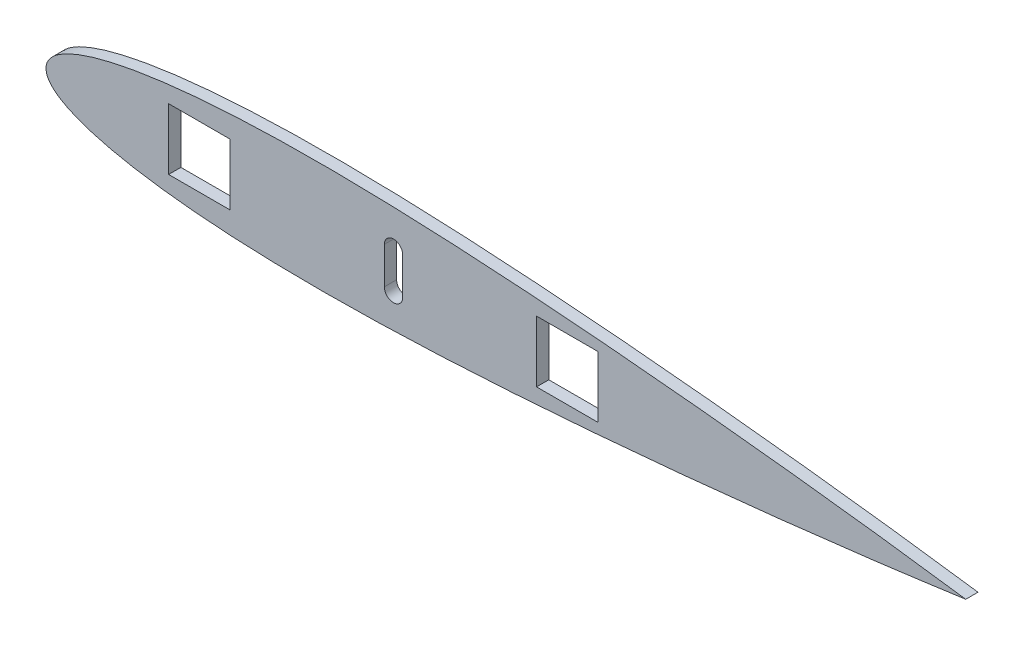
ISO-10303-21;
HEADER;
FILE_DESCRIPTION(('STEP AP214'),'2;1');
FILE_NAME('part.step','',(''),(''),'','','');
FILE_SCHEMA(('AUTOMOTIVE_DESIGN { 1 0 10303 214 1 1 1 1 }'));
ENDSEC;
DATA;
#1=APPLICATION_CONTEXT('core data for automotive mechanical design processes');
#2=APPLICATION_PROTOCOL_DEFINITION('international standard','automotive_design',2000,#1);
#3=PRODUCT_CONTEXT('',#1,'mechanical');
#4=PRODUCT('Part','Part','',(#3));
#5=PRODUCT_RELATED_PRODUCT_CATEGORY('part','',(#4));
#6=PRODUCT_DEFINITION_FORMATION('','',#4);
#7=PRODUCT_DEFINITION_CONTEXT('part definition',#1,'design');
#8=PRODUCT_DEFINITION('design','',#6,#7);
#9=PRODUCT_DEFINITION_SHAPE('','',#8);
#10=(LENGTH_UNIT() NAMED_UNIT(*) SI_UNIT(.MILLI.,.METRE.));
#11=(NAMED_UNIT(*) PLANE_ANGLE_UNIT() SI_UNIT($,.RADIAN.));
#12=(NAMED_UNIT(*) SI_UNIT($,.STERADIAN.) SOLID_ANGLE_UNIT());
#13=UNCERTAINTY_MEASURE_WITH_UNIT(LENGTH_MEASURE(1.E-05),#10,'distance_accuracy_value','');
#14=(GEOMETRIC_REPRESENTATION_CONTEXT(3) GLOBAL_UNCERTAINTY_ASSIGNED_CONTEXT((#13)) GLOBAL_UNIT_ASSIGNED_CONTEXT((#10,
#11,#12)) REPRESENTATION_CONTEXT('',''));
#15=CARTESIAN_POINT('',(0.,0.,0.));
#16=DIRECTION('',(0.,0.,1.));
#17=DIRECTION('',(1.,0.,0.));
#18=AXIS2_PLACEMENT_3D('',#15,#16,#17);
#19=CARTESIAN_POINT('',(73.959377623778,-7.91362684741891,2.));
#20=DIRECTION('',(0.,0.,-1.));
#21=DIRECTION('',(-1.,0.,0.));
#22=AXIS2_PLACEMENT_3D('',#19,#20,#21);
#23=PLANE('',#22);
#24=DIRECTION('',(0.,1.,0.));
#25=VECTOR('',#24,1.);
#26=CARTESIAN_POINT('',(58.1780561277094,-3.27924130211344,2.));
#27=LINE('',#26,#25);
#28=CARTESIAN_POINT('',(58.1780561277094,-3.27924130211344,2.));
#29=VERTEX_POINT('',#28);
#30=CARTESIAN_POINT('',(58.1780561277094,2.72116263132885,2.));
#31=VERTEX_POINT('',#30);
#32=EDGE_CURVE('E175',#29,#31,#27,.T.);
#33=ORIENTED_EDGE('',*,*,#32,.F.);
#34=CARTESIAN_POINT('',(56.6779551443489,-3.27924130211344,2.));
#35=DIRECTION('',(0.,0.,1.));
#36=DIRECTION('',(1.,0.,0.));
#37=AXIS2_PLACEMENT_3D('',#34,#35,#36);
#38=CIRCLE('',#37,1.50010098336057);
#39=CARTESIAN_POINT('',(55.1778541609883,-3.27924130211344,2.));
#40=VERTEX_POINT('',#39);
#41=EDGE_CURVE('E55',#40,#29,#38,.T.);
#42=ORIENTED_EDGE('',*,*,#41,.F.);
#43=DIRECTION('',(0.,-1.,0.));
#44=VECTOR('',#43,1.);
#45=CARTESIAN_POINT('',(55.1778541609883,-3.27924130211344,2.));
#46=LINE('',#45,#44);
#47=CARTESIAN_POINT('',(55.1778541609883,2.72116263132885,2.));
#48=VERTEX_POINT('',#47);
#49=EDGE_CURVE('E162',#48,#40,#46,.T.);
#50=ORIENTED_EDGE('',*,*,#49,.F.);
#51=CARTESIAN_POINT('',(56.6779551443489,2.72116263132885,2.));
#52=DIRECTION('',(0.,0.,1.));
#53=DIRECTION('',(1.,0.,0.));
#54=AXIS2_PLACEMENT_3D('',#51,#52,#53);
#55=CIRCLE('',#54,1.50010098336057);
#56=EDGE_CURVE('E166',#31,#48,#55,.T.);
#57=ORIENTED_EDGE('',*,*,#56,.F.);
#58=EDGE_LOOP('',(#33,#42,#50,#57));
#59=FACE_BOUND('',#58,.T.);
#60=DIRECTION('',(1.,0.,0.));
#61=VECTOR('',#60,1.);
#62=CARTESIAN_POINT('',(20.,5.,2.));
#63=LINE('',#62,#61);
#64=CARTESIAN_POINT('',(20.,5.,2.));
#65=VERTEX_POINT('',#64);
#66=CARTESIAN_POINT('',(30.,5.,2.));
#67=VERTEX_POINT('',#66);
#68=EDGE_CURVE('E211',#65,#67,#63,.T.);
#69=ORIENTED_EDGE('',*,*,#68,.T.);
#70=DIRECTION('',(0.,-1.,0.));
#71=VECTOR('',#70,1.);
#72=CARTESIAN_POINT('',(30.,5.,2.));
#73=LINE('',#72,#71);
#74=CARTESIAN_POINT('',(30.,-5.,2.));
#75=VERTEX_POINT('',#74);
#76=EDGE_CURVE('E259',#67,#75,#73,.T.);
#77=ORIENTED_EDGE('',*,*,#76,.T.);
#78=DIRECTION('',(1.,0.,0.));
#79=VECTOR('',#78,1.);
#80=CARTESIAN_POINT('',(20.,-5.,2.));
#81=LINE('',#80,#79);
#82=CARTESIAN_POINT('',(20.,-5.,2.));
#83=VERTEX_POINT('',#82);
#84=EDGE_CURVE('E254',#83,#75,#81,.T.);
#85=ORIENTED_EDGE('',*,*,#84,.F.);
#86=DIRECTION('',(0.,-1.,0.));
#87=VECTOR('',#86,1.);
#88=CARTESIAN_POINT('',(20.,5.,2.));
#89=LINE('',#88,#87);
#90=EDGE_CURVE('E250',#65,#83,#89,.T.);
#91=ORIENTED_EDGE('',*,*,#90,.F.);
#92=EDGE_LOOP('',(#69,#77,#85,#91));
#93=FACE_BOUND('',#92,.T.);
#94=CARTESIAN_POINT('',(0.,0.,2.));
#95=CARTESIAN_POINT('',(0.0177376787991794,-0.215631790194129,2.));
#96=CARTESIAN_POINT('',(0.0541247272767369,-0.657978530820046,2.));
#97=CARTESIAN_POINT('',(0.343214491645348,-1.29886256852425,2.));
#98=CARTESIAN_POINT('',(0.793518335307111,-1.91545308538195,2.));
#99=CARTESIAN_POINT('',(1.41859373850264,-2.51041162089754,2.));
#100=CARTESIAN_POINT('',(2.21044072610041,-3.085840760044,2.));
#101=CARTESIAN_POINT('',(3.16984033745882,-3.64229027011627,2.));
#102=CARTESIAN_POINT('',(4.29476246222924,-4.17912910418133,2.));
#103=CARTESIAN_POINT('',(5.58341356907541,-4.6951394099258,2.));
#104=CARTESIAN_POINT('',(7.03317259205414,-5.18878374333255,2.));
#105=CARTESIAN_POINT('',(8.64096444597628,-5.65840604873651,2.));
#106=CARTESIAN_POINT('',(11.0808665026297,-6.27289235058471,2.));
#107=CARTESIAN_POINT('',(14.5024468626391,-6.95545406859103,2.));
#108=CARTESIAN_POINT('',(19.0332651731447,-7.62778010369857,2.));
#109=CARTESIAN_POINT('',(24.0847382425464,-8.16948510481198,2.));
#110=CARTESIAN_POINT('',(29.6103003795524,-8.57335056911259,2.));
#111=CARTESIAN_POINT('',(36.6534461757636,-8.88420481359409,2.));
#112=CARTESIAN_POINT('',(45.2685528659167,-8.99448588106023,2.));
#113=CARTESIAN_POINT('',(55.4492469291882,-8.82398055942765,2.));
#114=CARTESIAN_POINT('',(67.2471798380359,-8.34657326807916,2.));
#115=CARTESIAN_POINT('',(80.3841274907154,-7.52487589483776,2.));
#116=CARTESIAN_POINT('',(94.4750896656351,-6.38138479152894,2.));
#117=CARTESIAN_POINT('',(108.784193237314,-5.01561269216372,2.));
#118=CARTESIAN_POINT('',(123.127907022394,-3.46129711721264,2.));
#119=CARTESIAN_POINT('',(136.579140490007,-1.82819578053142,2.));
#120=CARTESIAN_POINT('',(145.420848795191,-0.644801769861778,2.));
#121=CARTESIAN_POINT('',(149.505193272768,-0.0700512290801454,2.));
#122=CARTESIAN_POINT('',(149.970810303824,-0.00413247027789827,2.));
#123=CARTESIAN_POINT('',(150.,0.,2.));
#124=B_SPLINE_CURVE_WITH_KNOTS('',3,(#94,#95,#96,#97,#98,#99,#100,#101,#102,#103,#104,#105,#106,
#107,#108,#109,#110,#111,#112,#113,#114,#115,#116,#117,#118,#119,#120,#121,#122,#123),
.UNSPECIFIED.,.F.,.F.,(4,1,1,1,1,1,1,1,1,1,1,1,1,1,1,1,1,1,1,1,1,1,1,1,1,1,1,4),(0.,
0.00421754175159676,0.00865185901203598,0.013562306112597,0.0191370143035422,0.0254995560399083,
0.0327261684508418,0.0408616428239496,0.049929831579304,0.0599401249287409,0.0708919813887169,
0.082777029169175,0.109285667338437,0.139301077750872,0.172602406915682,0.208924358464581,
0.247964734529063,0.310881145592701,0.377906082539904,0.447678537728095,0.542484026957861,
0.636086647696326,0.724985378551976,0.824439815821109,0.919092538955119,0.990775422468578,
0.999421707975584,1.),.UNSPECIFIED.);
#125=CARTESIAN_POINT('',(0.,0.,2.));
#126=VERTEX_POINT('',#125);
#127=CARTESIAN_POINT('',(150.,0.,2.));
#128=VERTEX_POINT('',#127);
#129=EDGE_CURVE('E277',#126,#128,#124,.T.);
#130=ORIENTED_EDGE('',*,*,#129,.T.);
#131=CARTESIAN_POINT('',(150.,0.,2.));
#132=CARTESIAN_POINT('',(149.970810303824,0.00413247027790093,2.));
#133=CARTESIAN_POINT('',(149.505193272768,0.0700512290801424,2.));
#134=CARTESIAN_POINT('',(145.420848795191,0.644801769861765,2.));
#135=CARTESIAN_POINT('',(136.579140490007,1.82819578053143,2.));
#136=CARTESIAN_POINT('',(123.127907022393,3.46129711721265,2.));
#137=CARTESIAN_POINT('',(108.784193237312,5.01561269216374,2.));
#138=CARTESIAN_POINT('',(94.4750896656351,6.38138479152888,2.));
#139=CARTESIAN_POINT('',(80.384127490716,7.52487589483772,2.));
#140=CARTESIAN_POINT('',(67.2471798380362,8.34657326807912,2.));
#141=CARTESIAN_POINT('',(55.4492469291881,8.82398055942761,2.));
#142=CARTESIAN_POINT('',(45.268552865917,8.99448588106023,2.));
#143=CARTESIAN_POINT('',(36.6534461757634,8.88420481359412,2.));
#144=CARTESIAN_POINT('',(29.6103003795524,8.57335056911259,2.));
#145=CARTESIAN_POINT('',(24.0847382425465,8.16948510481198,2.));
#146=CARTESIAN_POINT('',(19.0332651731446,7.62778010369845,2.));
#147=CARTESIAN_POINT('',(14.502446862639,6.95545406859103,2.));
#148=CARTESIAN_POINT('',(11.0808665026298,6.27289235058471,2.));
#149=CARTESIAN_POINT('',(8.64096444597624,5.65840604873655,2.));
#150=CARTESIAN_POINT('',(7.03317259205418,5.18878374333255,2.));
#151=CARTESIAN_POINT('',(5.58341356907537,4.6951394099258,2.));
#152=CARTESIAN_POINT('',(4.29476246222922,4.17912910418133,2.));
#153=CARTESIAN_POINT('',(3.16984033745883,3.64229027011625,2.));
#154=CARTESIAN_POINT('',(2.21044072610041,3.085840760044,2.));
#155=CARTESIAN_POINT('',(1.41859373850265,2.51041162089755,2.));
#156=CARTESIAN_POINT('',(0.79351833530711,1.91545308538195,2.));
#157=CARTESIAN_POINT('',(0.343214491645345,1.29886256852423,2.));
#158=CARTESIAN_POINT('',(0.0541247272767373,0.657978530820046,2.));
#159=CARTESIAN_POINT('',(0.0177376787991794,0.215631790194129,2.));
#160=CARTESIAN_POINT('',(0.,0.,2.));
#161=B_SPLINE_CURVE_WITH_KNOTS('',3,(#131,#132,#133,#134,#135,#136,#137,#138,#139,#140,#141,
#142,#143,#144,#145,#146,#147,#148,#149,#150,#151,#152,#153,#154,#155,#156,#157,#158,#159,#160),
.UNSPECIFIED.,.F.,.F.,(4,1,1,1,1,1,1,1,1,1,1,1,1,1,1,1,1,1,1,1,1,1,1,1,1,1,1,4),(0.,
0.000578292024416172,0.00922457753142214,0.0809074610448807,0.175560184178891,0.275014621448024,
0.363913352303674,0.457515973042139,0.552321462271905,0.622093917460096,0.689118854407299,
0.752035265470937,0.791075641535419,0.827397593084318,0.860698922249128,0.890714332661563,
0.917222970830825,0.929108018611283,0.940059875071259,0.950070168420696,0.95913835717605,
0.967273831549158,0.974500443960092,0.980862985696458,0.986437693887403,0.991348140987964,
0.995782458248403,1.),.UNSPECIFIED.);
#162=EDGE_CURVE('E284',#128,#126,#161,.T.);
#163=ORIENTED_EDGE('',*,*,#162,.T.);
#164=EDGE_LOOP('',(#130,#163));
#165=FACE_BOUND('',#164,.T.);
#166=DIRECTION('',(1.,0.,0.));
#167=VECTOR('',#166,1.);
#168=CARTESIAN_POINT('',(80.,5.,2.));
#169=LINE('',#168,#167);
#170=CARTESIAN_POINT('',(80.,5.,2.));
#171=VERTEX_POINT('',#170);
#172=CARTESIAN_POINT('',(90.,5.,2.));
#173=VERTEX_POINT('',#172);
#174=EDGE_CURVE('E206',#171,#173,#169,.T.);
#175=ORIENTED_EDGE('',*,*,#174,.T.);
#176=DIRECTION('',(0.,-1.,0.));
#177=VECTOR('',#176,1.);
#178=CARTESIAN_POINT('',(90.,5.,2.));
#179=LINE('',#178,#177);
#180=CARTESIAN_POINT('',(90.,-4.99999999999999,2.));
#181=VERTEX_POINT('',#180);
#182=EDGE_CURVE('E210',#173,#181,#179,.T.);
#183=ORIENTED_EDGE('',*,*,#182,.T.);
#184=DIRECTION('',(1.,0.,0.));
#185=VECTOR('',#184,1.);
#186=CARTESIAN_POINT('',(80.,-4.99999999999999,2.));
#187=LINE('',#186,#185);
#188=CARTESIAN_POINT('',(80.,-4.99999999999999,2.));
#189=VERTEX_POINT('',#188);
#190=EDGE_CURVE('E215',#189,#181,#187,.T.);
#191=ORIENTED_EDGE('',*,*,#190,.F.);
#192=DIRECTION('',(0.,-1.,0.));
#193=VECTOR('',#192,1.);
#194=CARTESIAN_POINT('',(80.,5.,2.));
#195=LINE('',#194,#193);
#196=EDGE_CURVE('E194',#171,#189,#195,.T.);
#197=ORIENTED_EDGE('',*,*,#196,.F.);
#198=EDGE_LOOP('',(#175,#183,#191,#197));
#199=FACE_BOUND('',#198,.T.);
#200=ADVANCED_FACE('F38',(#59,#93,#165,#199),#23,.F.);
#201=CARTESIAN_POINT('',(73.959377623778,-7.91362684741891,0.));
#202=DIRECTION('',(0.,0.,-1.));
#203=DIRECTION('',(-1.,0.,0.));
#204=AXIS2_PLACEMENT_3D('',#201,#202,#203);
#205=PLANE('',#204);
#206=CARTESIAN_POINT('',(56.6779551443489,-3.27924130211344,0.));
#207=DIRECTION('',(0.,0.,1.));
#208=DIRECTION('',(1.,0.,0.));
#209=AXIS2_PLACEMENT_3D('',#206,#207,#208);
#210=CIRCLE('',#209,1.50010098336057);
#211=CARTESIAN_POINT('',(55.1778541609883,-3.27924130211344,0.));
#212=VERTEX_POINT('',#211);
#213=CARTESIAN_POINT('',(58.1780561277094,-3.27924130211344,0.));
#214=VERTEX_POINT('',#213);
#215=EDGE_CURVE('E143',#212,#214,#210,.T.);
#216=ORIENTED_EDGE('',*,*,#215,.T.);
#217=DIRECTION('',(0.,1.,0.));
#218=VECTOR('',#217,1.);
#219=CARTESIAN_POINT('',(58.1780561277094,-3.27924130211344,0.));
#220=LINE('',#219,#218);
#221=CARTESIAN_POINT('',(58.1780561277094,2.72116263132885,0.));
#222=VERTEX_POINT('',#221);
#223=EDGE_CURVE('E153',#214,#222,#220,.T.);
#224=ORIENTED_EDGE('',*,*,#223,.T.);
#225=CARTESIAN_POINT('',(56.6779551443489,2.72116263132885,0.));
#226=DIRECTION('',(0.,0.,1.));
#227=DIRECTION('',(1.,0.,0.));
#228=AXIS2_PLACEMENT_3D('',#225,#226,#227);
#229=CIRCLE('',#228,1.50010098336057);
#230=CARTESIAN_POINT('',(55.1778541609883,2.72116263132885,0.));
#231=VERTEX_POINT('',#230);
#232=EDGE_CURVE('E63',#222,#231,#229,.T.);
#233=ORIENTED_EDGE('',*,*,#232,.T.);
#234=DIRECTION('',(0.,-1.,0.));
#235=VECTOR('',#234,1.);
#236=CARTESIAN_POINT('',(55.1778541609883,-3.27924130211344,0.));
#237=LINE('',#236,#235);
#238=EDGE_CURVE('E150',#231,#212,#237,.T.);
#239=ORIENTED_EDGE('',*,*,#238,.T.);
#240=EDGE_LOOP('',(#216,#224,#233,#239));
#241=FACE_BOUND('',#240,.T.);
#242=CARTESIAN_POINT('',(0.,0.,0.));
#243=CARTESIAN_POINT('',(0.0177376787991794,-0.215631790194129,0.));
#244=CARTESIAN_POINT('',(0.0541247272767369,-0.657978530820046,0.));
#245=CARTESIAN_POINT('',(0.343214491645348,-1.29886256852425,0.));
#246=CARTESIAN_POINT('',(0.793518335307111,-1.91545308538195,0.));
#247=CARTESIAN_POINT('',(1.41859373850264,-2.51041162089754,0.));
#248=CARTESIAN_POINT('',(2.21044072610041,-3.085840760044,0.));
#249=CARTESIAN_POINT('',(3.16984033745882,-3.64229027011627,0.));
#250=CARTESIAN_POINT('',(4.29476246222924,-4.17912910418133,0.));
#251=CARTESIAN_POINT('',(5.58341356907541,-4.6951394099258,0.));
#252=CARTESIAN_POINT('',(7.03317259205414,-5.18878374333255,0.));
#253=CARTESIAN_POINT('',(8.64096444597628,-5.65840604873651,0.));
#254=CARTESIAN_POINT('',(11.0808665026297,-6.27289235058471,0.));
#255=CARTESIAN_POINT('',(14.5024468626391,-6.95545406859103,0.));
#256=CARTESIAN_POINT('',(19.0332651731447,-7.62778010369857,0.));
#257=CARTESIAN_POINT('',(24.0847382425464,-8.16948510481198,0.));
#258=CARTESIAN_POINT('',(29.6103003795524,-8.57335056911259,0.));
#259=CARTESIAN_POINT('',(36.6534461757636,-8.88420481359409,0.));
#260=CARTESIAN_POINT('',(45.2685528659167,-8.99448588106023,0.));
#261=CARTESIAN_POINT('',(55.4492469291882,-8.82398055942765,0.));
#262=CARTESIAN_POINT('',(67.2471798380359,-8.34657326807916,0.));
#263=CARTESIAN_POINT('',(80.3841274907154,-7.52487589483776,0.));
#264=CARTESIAN_POINT('',(94.4750896656351,-6.38138479152894,0.));
#265=CARTESIAN_POINT('',(108.784193237314,-5.01561269216372,0.));
#266=CARTESIAN_POINT('',(123.127907022394,-3.46129711721264,0.));
#267=CARTESIAN_POINT('',(136.579140490007,-1.82819578053142,0.));
#268=CARTESIAN_POINT('',(145.420848795191,-0.644801769861778,0.));
#269=CARTESIAN_POINT('',(149.505193272768,-0.0700512290801454,0.));
#270=CARTESIAN_POINT('',(149.970810303824,-0.00413247027789827,0.));
#271=CARTESIAN_POINT('',(150.,0.,0.));
#272=B_SPLINE_CURVE_WITH_KNOTS('',3,(#242,#243,#244,#245,#246,#247,#248,#249,#250,#251,#252,
#253,#254,#255,#256,#257,#258,#259,#260,#261,#262,#263,#264,#265,#266,#267,#268,#269,#270,#271),
.UNSPECIFIED.,.F.,.F.,(4,1,1,1,1,1,1,1,1,1,1,1,1,1,1,1,1,1,1,1,1,1,1,1,1,1,1,4),(0.,
0.00421754175159676,0.00865185901203598,0.013562306112597,0.0191370143035422,0.0254995560399083,
0.0327261684508418,0.0408616428239496,0.049929831579304,0.0599401249287409,0.0708919813887169,
0.082777029169175,0.109285667338437,0.139301077750872,0.172602406915682,0.208924358464581,
0.247964734529063,0.310881145592701,0.377906082539904,0.447678537728095,0.542484026957861,
0.636086647696326,0.724985378551976,0.824439815821109,0.919092538955119,0.990775422468578,
0.999421707975584,1.),.UNSPECIFIED.);
#273=CARTESIAN_POINT('',(0.,0.,0.));
#274=VERTEX_POINT('',#273);
#275=CARTESIAN_POINT('',(150.,0.,0.));
#276=VERTEX_POINT('',#275);
#277=EDGE_CURVE('E235',#274,#276,#272,.T.);
#278=ORIENTED_EDGE('',*,*,#277,.F.);
#279=CARTESIAN_POINT('',(150.,0.,0.));
#280=CARTESIAN_POINT('',(149.970810303824,0.00413247027790093,0.));
#281=CARTESIAN_POINT('',(149.505193272768,0.0700512290801424,0.));
#282=CARTESIAN_POINT('',(145.420848795191,0.644801769861765,0.));
#283=CARTESIAN_POINT('',(136.579140490007,1.82819578053143,0.));
#284=CARTESIAN_POINT('',(123.127907022393,3.46129711721265,0.));
#285=CARTESIAN_POINT('',(108.784193237312,5.01561269216374,0.));
#286=CARTESIAN_POINT('',(94.4750896656351,6.38138479152888,0.));
#287=CARTESIAN_POINT('',(80.384127490716,7.52487589483772,0.));
#288=CARTESIAN_POINT('',(67.2471798380362,8.34657326807912,0.));
#289=CARTESIAN_POINT('',(55.4492469291881,8.82398055942761,0.));
#290=CARTESIAN_POINT('',(45.268552865917,8.99448588106023,0.));
#291=CARTESIAN_POINT('',(36.6534461757634,8.88420481359412,0.));
#292=CARTESIAN_POINT('',(29.6103003795524,8.57335056911259,0.));
#293=CARTESIAN_POINT('',(24.0847382425465,8.16948510481198,0.));
#294=CARTESIAN_POINT('',(19.0332651731446,7.62778010369845,0.));
#295=CARTESIAN_POINT('',(14.502446862639,6.95545406859103,0.));
#296=CARTESIAN_POINT('',(11.0808665026298,6.27289235058471,0.));
#297=CARTESIAN_POINT('',(8.64096444597624,5.65840604873655,0.));
#298=CARTESIAN_POINT('',(7.03317259205418,5.18878374333255,0.));
#299=CARTESIAN_POINT('',(5.58341356907537,4.6951394099258,0.));
#300=CARTESIAN_POINT('',(4.29476246222922,4.17912910418133,0.));
#301=CARTESIAN_POINT('',(3.16984033745883,3.64229027011625,0.));
#302=CARTESIAN_POINT('',(2.21044072610041,3.085840760044,0.));
#303=CARTESIAN_POINT('',(1.41859373850265,2.51041162089755,0.));
#304=CARTESIAN_POINT('',(0.79351833530711,1.91545308538195,0.));
#305=CARTESIAN_POINT('',(0.343214491645345,1.29886256852423,0.));
#306=CARTESIAN_POINT('',(0.0541247272767373,0.657978530820046,0.));
#307=CARTESIAN_POINT('',(0.0177376787991794,0.215631790194129,0.));
#308=CARTESIAN_POINT('',(0.,0.,0.));
#309=B_SPLINE_CURVE_WITH_KNOTS('',3,(#279,#280,#281,#282,#283,#284,#285,#286,#287,#288,#289,
#290,#291,#292,#293,#294,#295,#296,#297,#298,#299,#300,#301,#302,#303,#304,#305,#306,#307,#308),
.UNSPECIFIED.,.F.,.F.,(4,1,1,1,1,1,1,1,1,1,1,1,1,1,1,1,1,1,1,1,1,1,1,1,1,1,1,4),(0.,
0.000578292024416172,0.00922457753142214,0.0809074610448807,0.175560184178891,0.275014621448024,
0.363913352303674,0.457515973042139,0.552321462271905,0.622093917460096,0.689118854407299,
0.752035265470937,0.791075641535419,0.827397593084318,0.860698922249128,0.890714332661563,
0.917222970830825,0.929108018611283,0.940059875071259,0.950070168420696,0.95913835717605,
0.967273831549158,0.974500443960092,0.980862985696458,0.986437693887403,0.991348140987964,
0.995782458248403,1.),.UNSPECIFIED.);
#310=EDGE_CURVE('E285',#276,#274,#309,.T.);
#311=ORIENTED_EDGE('',*,*,#310,.F.);
#312=EDGE_LOOP('',(#278,#311));
#313=FACE_BOUND('',#312,.T.);
#314=DIRECTION('',(0.,-1.,0.));
#315=VECTOR('',#314,1.);
#316=CARTESIAN_POINT('',(30.,5.,0.));
#317=LINE('',#316,#315);
#318=CARTESIAN_POINT('',(30.,5.,0.));
#319=VERTEX_POINT('',#318);
#320=CARTESIAN_POINT('',(30.,-5.,0.));
#321=VERTEX_POINT('',#320);
#322=EDGE_CURVE('E273',#319,#321,#317,.T.);
#323=ORIENTED_EDGE('',*,*,#322,.F.);
#324=DIRECTION('',(1.,0.,0.));
#325=VECTOR('',#324,1.);
#326=CARTESIAN_POINT('',(20.,5.,0.));
#327=LINE('',#326,#325);
#328=CARTESIAN_POINT('',(20.,5.,0.));
#329=VERTEX_POINT('',#328);
#330=EDGE_CURVE('E255',#329,#319,#327,.T.);
#331=ORIENTED_EDGE('',*,*,#330,.F.);
#332=DIRECTION('',(0.,-1.,0.));
#333=VECTOR('',#332,1.);
#334=CARTESIAN_POINT('',(20.,5.,0.));
#335=LINE('',#334,#333);
#336=CARTESIAN_POINT('',(20.,-5.,0.));
#337=VERTEX_POINT('',#336);
#338=EDGE_CURVE('E249',#329,#337,#335,.T.);
#339=ORIENTED_EDGE('',*,*,#338,.T.);
#340=DIRECTION('',(1.,0.,0.));
#341=VECTOR('',#340,1.);
#342=CARTESIAN_POINT('',(20.,-5.,0.));
#343=LINE('',#342,#341);
#344=EDGE_CURVE('E269',#337,#321,#343,.T.);
#345=ORIENTED_EDGE('',*,*,#344,.T.);
#346=EDGE_LOOP('',(#323,#331,#339,#345));
#347=FACE_BOUND('',#346,.T.);
#348=DIRECTION('',(0.,-1.,0.));
#349=VECTOR('',#348,1.);
#350=CARTESIAN_POINT('',(90.,5.,0.));
#351=LINE('',#350,#349);
#352=CARTESIAN_POINT('',(90.,5.,0.));
#353=VERTEX_POINT('',#352);
#354=CARTESIAN_POINT('',(90.,-4.99999999999999,0.));
#355=VERTEX_POINT('',#354);
#356=EDGE_CURVE('E193',#353,#355,#351,.T.);
#357=ORIENTED_EDGE('',*,*,#356,.F.);
#358=DIRECTION('',(1.,0.,0.));
#359=VECTOR('',#358,1.);
#360=CARTESIAN_POINT('',(80.,5.,0.));
#361=LINE('',#360,#359);
#362=CARTESIAN_POINT('',(80.,5.,0.));
#363=VERTEX_POINT('',#362);
#364=EDGE_CURVE('E190',#363,#353,#361,.T.);
#365=ORIENTED_EDGE('',*,*,#364,.F.);
#366=DIRECTION('',(0.,-1.,0.));
#367=VECTOR('',#366,1.);
#368=CARTESIAN_POINT('',(80.,5.,0.));
#369=LINE('',#368,#367);
#370=CARTESIAN_POINT('',(80.,-4.99999999999999,0.));
#371=VERTEX_POINT('',#370);
#372=EDGE_CURVE('E201',#363,#371,#369,.T.);
#373=ORIENTED_EDGE('',*,*,#372,.T.);
#374=DIRECTION('',(1.,0.,0.));
#375=VECTOR('',#374,1.);
#376=CARTESIAN_POINT('',(80.,-4.99999999999999,0.));
#377=LINE('',#376,#375);
#378=EDGE_CURVE('E197',#371,#355,#377,.T.);
#379=ORIENTED_EDGE('',*,*,#378,.T.);
#380=EDGE_LOOP('',(#357,#365,#373,#379));
#381=FACE_BOUND('',#380,.T.);
#382=ADVANCED_FACE('F158',(#241,#313,#347,#381),#205,.T.);
#383=DIRECTION('',(0.,0.,-1.));
#384=VECTOR('',#383,1.);
#385=SURFACE_OF_LINEAR_EXTRUSION('',#124,#384);
#386=ORIENTED_EDGE('',*,*,#277,.T.);
#387=DIRECTION('',(0.,0.,-1.));
#388=VECTOR('',#387,1.);
#389=CARTESIAN_POINT('',(150.,0.,2.));
#390=LINE('',#389,#388);
#391=EDGE_CURVE('E11',#128,#276,#390,.T.);
#392=ORIENTED_EDGE('',*,*,#391,.F.);
#393=ORIENTED_EDGE('',*,*,#129,.F.);
#394=DIRECTION('',(0.,0.,-1.));
#395=VECTOR('',#394,1.);
#396=CARTESIAN_POINT('',(0.,0.,2.));
#397=LINE('',#396,#395);
#398=EDGE_CURVE('E48',#126,#274,#397,.T.);
#399=ORIENTED_EDGE('',*,*,#398,.T.);
#400=EDGE_LOOP('',(#386,#392,#393,#399));
#401=FACE_BOUND('',#400,.T.);
#402=ADVANCED_FACE('F40',(#401),#385,.F.);
#403=DIRECTION('',(0.,0.,-1.));
#404=VECTOR('',#403,1.);
#405=SURFACE_OF_LINEAR_EXTRUSION('',#161,#404);
#406=ORIENTED_EDGE('',*,*,#310,.T.);
#407=ORIENTED_EDGE('',*,*,#398,.F.);
#408=ORIENTED_EDGE('',*,*,#162,.F.);
#409=ORIENTED_EDGE('',*,*,#391,.T.);
#410=EDGE_LOOP('',(#406,#407,#408,#409));
#411=FACE_BOUND('',#410,.T.);
#412=ADVANCED_FACE('F300',(#411),#405,.F.);
#413=CARTESIAN_POINT('',(20.,5.,0.));
#414=DIRECTION('',(0.,-1.,0.));
#415=DIRECTION('',(0.,0.,-1.));
#416=AXIS2_PLACEMENT_3D('',#413,#414,#415);
#417=PLANE('',#416);
#418=ORIENTED_EDGE('',*,*,#68,.F.);
#419=DIRECTION('',(0.,0.,1.));
#420=VECTOR('',#419,1.);
#421=CARTESIAN_POINT('',(20.,5.,0.));
#422=LINE('',#421,#420);
#423=EDGE_CURVE('E245',#329,#65,#422,.T.);
#424=ORIENTED_EDGE('',*,*,#423,.F.);
#425=ORIENTED_EDGE('',*,*,#330,.T.);
#426=DIRECTION('',(0.,0.,1.));
#427=VECTOR('',#426,1.);
#428=CARTESIAN_POINT('',(30.,5.,0.));
#429=LINE('',#428,#427);
#430=EDGE_CURVE('E184',#319,#67,#429,.T.);
#431=ORIENTED_EDGE('',*,*,#430,.T.);
#432=EDGE_LOOP('',(#418,#424,#425,#431));
#433=FACE_BOUND('',#432,.T.);
#434=ADVANCED_FACE('F303',(#433),#417,.T.);
#435=CARTESIAN_POINT('',(30.,5.,0.));
#436=DIRECTION('',(-1.,0.,0.));
#437=DIRECTION('',(0.,0.,1.));
#438=AXIS2_PLACEMENT_3D('',#435,#436,#437);
#439=PLANE('',#438);
#440=ORIENTED_EDGE('',*,*,#76,.F.);
#441=ORIENTED_EDGE('',*,*,#430,.F.);
#442=ORIENTED_EDGE('',*,*,#322,.T.);
#443=DIRECTION('',(0.,0.,1.));
#444=VECTOR('',#443,1.);
#445=CARTESIAN_POINT('',(30.,-5.,0.));
#446=LINE('',#445,#444);
#447=EDGE_CURVE('E239',#321,#75,#446,.T.);
#448=ORIENTED_EDGE('',*,*,#447,.T.);
#449=EDGE_LOOP('',(#440,#441,#442,#448));
#450=FACE_BOUND('',#449,.T.);
#451=ADVANCED_FACE('F318',(#450),#439,.T.);
#452=CARTESIAN_POINT('',(20.,-5.,0.));
#453=DIRECTION('',(0.,-1.,0.));
#454=DIRECTION('',(1.,0.,0.));
#455=AXIS2_PLACEMENT_3D('',#452,#453,#454);
#456=PLANE('',#455);
#457=ORIENTED_EDGE('',*,*,#84,.T.);
#458=ORIENTED_EDGE('',*,*,#447,.F.);
#459=ORIENTED_EDGE('',*,*,#344,.F.);
#460=DIRECTION('',(0.,0.,1.));
#461=VECTOR('',#460,1.);
#462=CARTESIAN_POINT('',(20.,-5.,0.));
#463=LINE('',#462,#461);
#464=EDGE_CURVE('E242',#337,#83,#463,.T.);
#465=ORIENTED_EDGE('',*,*,#464,.T.);
#466=EDGE_LOOP('',(#457,#458,#459,#465));
#467=FACE_BOUND('',#466,.T.);
#468=ADVANCED_FACE('F314',(#467),#456,.F.);
#469=CARTESIAN_POINT('',(20.,5.,0.));
#470=DIRECTION('',(-1.,0.,0.));
#471=DIRECTION('',(0.,0.,1.));
#472=AXIS2_PLACEMENT_3D('',#469,#470,#471);
#473=PLANE('',#472);
#474=ORIENTED_EDGE('',*,*,#90,.T.);
#475=ORIENTED_EDGE('',*,*,#464,.F.);
#476=ORIENTED_EDGE('',*,*,#338,.F.);
#477=ORIENTED_EDGE('',*,*,#423,.T.);
#478=EDGE_LOOP('',(#474,#475,#476,#477));
#479=FACE_BOUND('',#478,.T.);
#480=ADVANCED_FACE('F310',(#479),#473,.F.);
#481=CARTESIAN_POINT('',(80.,5.,0.));
#482=DIRECTION('',(0.,-1.,0.));
#483=DIRECTION('',(0.,0.,-1.));
#484=AXIS2_PLACEMENT_3D('',#481,#482,#483);
#485=PLANE('',#484);
#486=ORIENTED_EDGE('',*,*,#174,.F.);
#487=DIRECTION('',(0.,0.,1.));
#488=VECTOR('',#487,1.);
#489=CARTESIAN_POINT('',(80.,5.,0.));
#490=LINE('',#489,#488);
#491=EDGE_CURVE('E205',#363,#171,#490,.T.);
#492=ORIENTED_EDGE('',*,*,#491,.F.);
#493=ORIENTED_EDGE('',*,*,#364,.T.);
#494=DIRECTION('',(0.,0.,1.));
#495=VECTOR('',#494,1.);
#496=CARTESIAN_POINT('',(90.,5.,0.));
#497=LINE('',#496,#495);
#498=EDGE_CURVE('E231',#353,#173,#497,.T.);
#499=ORIENTED_EDGE('',*,*,#498,.T.);
#500=EDGE_LOOP('',(#486,#492,#493,#499));
#501=FACE_BOUND('',#500,.T.);
#502=ADVANCED_FACE('F313',(#501),#485,.T.);
#503=CARTESIAN_POINT('',(90.,5.,0.));
#504=DIRECTION('',(-1.,0.,0.));
#505=DIRECTION('',(0.,0.,1.));
#506=AXIS2_PLACEMENT_3D('',#503,#504,#505);
#507=PLANE('',#506);
#508=ORIENTED_EDGE('',*,*,#182,.F.);
#509=ORIENTED_EDGE('',*,*,#498,.F.);
#510=ORIENTED_EDGE('',*,*,#356,.T.);
#511=DIRECTION('',(0.,0.,1.));
#512=VECTOR('',#511,1.);
#513=CARTESIAN_POINT('',(90.,-4.99999999999999,0.));
#514=LINE('',#513,#512);
#515=EDGE_CURVE('E228',#355,#181,#514,.T.);
#516=ORIENTED_EDGE('',*,*,#515,.T.);
#517=EDGE_LOOP('',(#508,#509,#510,#516));
#518=FACE_BOUND('',#517,.T.);
#519=ADVANCED_FACE('F328',(#518),#507,.T.);
#520=CARTESIAN_POINT('',(80.,-4.99999999999999,0.));
#521=DIRECTION('',(0.,-1.,0.));
#522=DIRECTION('',(0.,0.,-1.));
#523=AXIS2_PLACEMENT_3D('',#520,#521,#522);
#524=PLANE('',#523);
#525=ORIENTED_EDGE('',*,*,#190,.T.);
#526=ORIENTED_EDGE('',*,*,#515,.F.);
#527=ORIENTED_EDGE('',*,*,#378,.F.);
#528=DIRECTION('',(0.,0.,1.));
#529=VECTOR('',#528,1.);
#530=CARTESIAN_POINT('',(80.,-4.99999999999999,0.));
#531=LINE('',#530,#529);
#532=EDGE_CURVE('E225',#371,#189,#531,.T.);
#533=ORIENTED_EDGE('',*,*,#532,.T.);
#534=EDGE_LOOP('',(#525,#526,#527,#533));
#535=FACE_BOUND('',#534,.T.);
#536=ADVANCED_FACE('F332',(#535),#524,.F.);
#537=CARTESIAN_POINT('',(80.,5.,0.));
#538=DIRECTION('',(-1.,0.,0.));
#539=DIRECTION('',(0.,0.,1.));
#540=AXIS2_PLACEMENT_3D('',#537,#538,#539);
#541=PLANE('',#540);
#542=ORIENTED_EDGE('',*,*,#196,.T.);
#543=ORIENTED_EDGE('',*,*,#532,.F.);
#544=ORIENTED_EDGE('',*,*,#372,.F.);
#545=ORIENTED_EDGE('',*,*,#491,.T.);
#546=EDGE_LOOP('',(#542,#543,#544,#545));
#547=FACE_BOUND('',#546,.T.);
#548=ADVANCED_FACE('F336',(#547),#541,.F.);
#549=CARTESIAN_POINT('',(56.6779551443489,-3.27924130211344,0.));
#550=DIRECTION('',(0.,0.,1.));
#551=DIRECTION('',(1.,0.,0.));
#552=AXIS2_PLACEMENT_3D('',#549,#550,#551);
#553=CYLINDRICAL_SURFACE('',#552,1.50010098336057);
#554=ORIENTED_EDGE('',*,*,#41,.T.);
#555=DIRECTION('',(0.,0.,1.));
#556=VECTOR('',#555,1.);
#557=CARTESIAN_POINT('',(58.1780561277094,-3.27924130211344,0.));
#558=LINE('',#557,#556);
#559=EDGE_CURVE('E139',#214,#29,#558,.T.);
#560=ORIENTED_EDGE('',*,*,#559,.F.);
#561=ORIENTED_EDGE('',*,*,#215,.F.);
#562=DIRECTION('',(0.,0.,1.));
#563=VECTOR('',#562,1.);
#564=CARTESIAN_POINT('',(55.1778541609883,-3.27924130211344,0.));
#565=LINE('',#564,#563);
#566=EDGE_CURVE('E181',#212,#40,#565,.T.);
#567=ORIENTED_EDGE('',*,*,#566,.T.);
#568=EDGE_LOOP('',(#554,#560,#561,#567));
#569=FACE_BOUND('',#568,.T.);
#570=ADVANCED_FACE('F141',(#569),#553,.F.);
#571=CARTESIAN_POINT('',(55.1778541609883,-3.27924130211344,0.));
#572=DIRECTION('',(-1.,0.,0.));
#573=DIRECTION('',(0.,0.,1.));
#574=AXIS2_PLACEMENT_3D('',#571,#572,#573);
#575=PLANE('',#574);
#576=ORIENTED_EDGE('',*,*,#49,.T.);
#577=ORIENTED_EDGE('',*,*,#566,.F.);
#578=ORIENTED_EDGE('',*,*,#238,.F.);
#579=DIRECTION('',(0.,0.,1.));
#580=VECTOR('',#579,1.);
#581=CARTESIAN_POINT('',(55.1778541609883,2.72116263132885,0.));
#582=LINE('',#581,#580);
#583=EDGE_CURVE('E185',#231,#48,#582,.T.);
#584=ORIENTED_EDGE('',*,*,#583,.T.);
#585=EDGE_LOOP('',(#576,#577,#578,#584));
#586=FACE_BOUND('',#585,.T.);
#587=ADVANCED_FACE('F343',(#586),#575,.F.);
#588=CARTESIAN_POINT('',(56.6779551443489,2.72116263132885,0.));
#589=DIRECTION('',(0.,0.,1.));
#590=DIRECTION('',(1.,0.,0.));
#591=AXIS2_PLACEMENT_3D('',#588,#589,#590);
#592=CYLINDRICAL_SURFACE('',#591,1.50010098336057);
#593=ORIENTED_EDGE('',*,*,#56,.T.);
#594=ORIENTED_EDGE('',*,*,#583,.F.);
#595=ORIENTED_EDGE('',*,*,#232,.F.);
#596=DIRECTION('',(0.,0.,1.));
#597=VECTOR('',#596,1.);
#598=CARTESIAN_POINT('',(58.1780561277094,2.72116263132885,0.));
#599=LINE('',#598,#597);
#600=EDGE_CURVE('E149',#222,#31,#599,.T.);
#601=ORIENTED_EDGE('',*,*,#600,.T.);
#602=EDGE_LOOP('',(#593,#594,#595,#601));
#603=FACE_BOUND('',#602,.T.);
#604=ADVANCED_FACE('F346',(#603),#592,.F.);
#605=CARTESIAN_POINT('',(58.1780561277094,-3.27924130211344,0.));
#606=DIRECTION('',(1.,0.,0.));
#607=DIRECTION('',(0.,0.,-1.));
#608=AXIS2_PLACEMENT_3D('',#605,#606,#607);
#609=PLANE('',#608);
#610=ORIENTED_EDGE('',*,*,#32,.T.);
#611=ORIENTED_EDGE('',*,*,#600,.F.);
#612=ORIENTED_EDGE('',*,*,#223,.F.);
#613=ORIENTED_EDGE('',*,*,#559,.T.);
#614=EDGE_LOOP('',(#610,#611,#612,#613));
#615=FACE_BOUND('',#614,.T.);
#616=ADVANCED_FACE('F154',(#615),#609,.F.);
#617=CLOSED_SHELL('',(#200,#382,#402,#412,#434,#451,#468,#480,#502,#519,#536,#548,#570,#587,
#604,#616));
#618=MANIFOLD_SOLID_BREP('B2',#617);
#619=ADVANCED_BREP_SHAPE_REPRESENTATION('',(#18,#618),#14);
#620=SHAPE_DEFINITION_REPRESENTATION(#9,#619);
ENDSEC;
END-ISO-10303-21;
